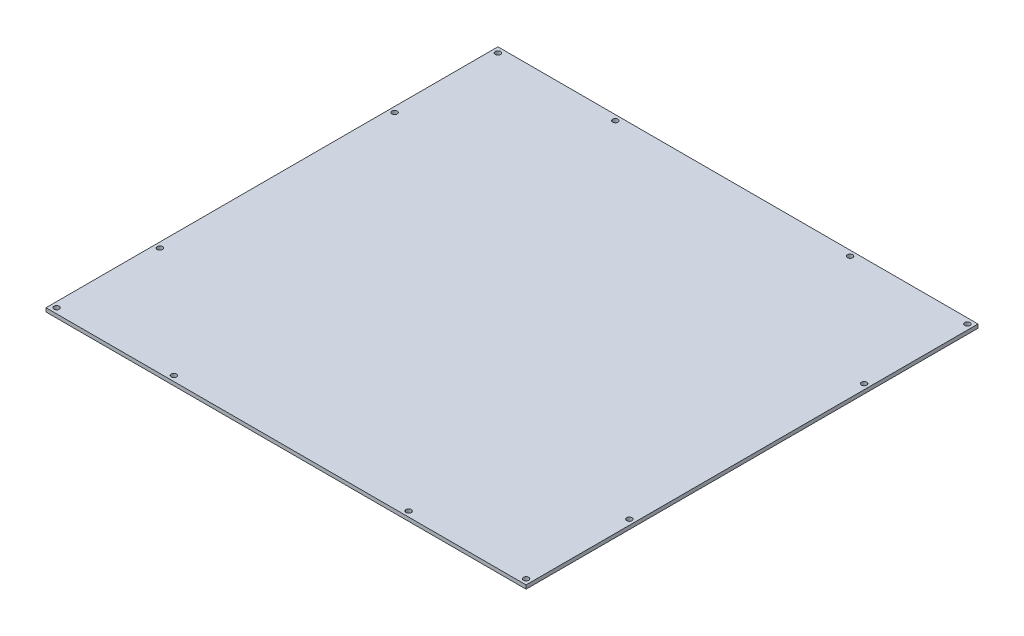
ISO-10303-21;
HEADER;
FILE_DESCRIPTION(('STEP AP214'),'2;1');
FILE_NAME('part.step','',(''),(''),'','','');
FILE_SCHEMA(('AUTOMOTIVE_DESIGN { 1 0 10303 214 1 1 1 1 }'));
ENDSEC;
DATA;
#1=APPLICATION_CONTEXT('core data for automotive mechanical design processes');
#2=APPLICATION_PROTOCOL_DEFINITION('international standard','automotive_design',2000,#1);
#3=PRODUCT_CONTEXT('',#1,'mechanical');
#4=PRODUCT('Part','Part','',(#3));
#5=PRODUCT_RELATED_PRODUCT_CATEGORY('part','',(#4));
#6=PRODUCT_DEFINITION_FORMATION('','',#4);
#7=PRODUCT_DEFINITION_CONTEXT('part definition',#1,'design');
#8=PRODUCT_DEFINITION('design','',#6,#7);
#9=PRODUCT_DEFINITION_SHAPE('','',#8);
#10=(LENGTH_UNIT() NAMED_UNIT(*) SI_UNIT(.MILLI.,.METRE.));
#11=(NAMED_UNIT(*) PLANE_ANGLE_UNIT() SI_UNIT($,.RADIAN.));
#12=(NAMED_UNIT(*) SI_UNIT($,.STERADIAN.) SOLID_ANGLE_UNIT());
#13=UNCERTAINTY_MEASURE_WITH_UNIT(LENGTH_MEASURE(1.E-05),#10,'distance_accuracy_value','');
#14=(GEOMETRIC_REPRESENTATION_CONTEXT(3) GLOBAL_UNCERTAINTY_ASSIGNED_CONTEXT((#13)) GLOBAL_UNIT_ASSIGNED_CONTEXT((#10,
#11,#12)) REPRESENTATION_CONTEXT('',''));
#15=CARTESIAN_POINT('',(0.,0.,0.));
#16=DIRECTION('',(0.,0.,1.));
#17=DIRECTION('',(1.,0.,0.));
#18=AXIS2_PLACEMENT_3D('',#15,#16,#17);
#19=CARTESIAN_POINT('',(0.,0.,0.));
#20=DIRECTION('',(0.,-1.,0.));
#21=DIRECTION('',(0.,0.,-1.));
#22=AXIS2_PLACEMENT_3D('',#19,#20,#21);
#23=PLANE('',#22);
#24=CARTESIAN_POINT('',(-200.,0.,-188.));
#25=DIRECTION('',(0.,1.,0.));
#26=DIRECTION('',(0.,0.,1.));
#27=AXIS2_PLACEMENT_3D('',#24,#25,#26);
#28=CIRCLE('',#27,2.25);
#29=CARTESIAN_POINT('',(-200.,0.,-185.75));
#30=VERTEX_POINT('',#29);
#31=EDGE_CURVE('E216',#30,#30,#28,.T.);
#32=ORIENTED_EDGE('',*,*,#31,.T.);
#33=EDGE_LOOP('',(#32));
#34=FACE_BOUND('',#33,.T.);
#35=CARTESIAN_POINT('',(-200.,0.,-100.));
#36=DIRECTION('',(0.,1.,0.));
#37=DIRECTION('',(0.,0.,1.));
#38=AXIS2_PLACEMENT_3D('',#35,#36,#37);
#39=CIRCLE('',#38,2.25);
#40=CARTESIAN_POINT('',(-200.,0.,-97.75));
#41=VERTEX_POINT('',#40);
#42=EDGE_CURVE('E208',#41,#41,#39,.T.);
#43=ORIENTED_EDGE('',*,*,#42,.T.);
#44=EDGE_LOOP('',(#43));
#45=FACE_BOUND('',#44,.T.);
#46=CARTESIAN_POINT('',(-200.,0.,100.));
#47=DIRECTION('',(0.,1.,0.));
#48=DIRECTION('',(0.,0.,1.));
#49=AXIS2_PLACEMENT_3D('',#46,#47,#48);
#50=CIRCLE('',#49,2.25);
#51=CARTESIAN_POINT('',(-200.,0.,102.25));
#52=VERTEX_POINT('',#51);
#53=EDGE_CURVE('E200',#52,#52,#50,.T.);
#54=ORIENTED_EDGE('',*,*,#53,.T.);
#55=EDGE_LOOP('',(#54));
#56=FACE_BOUND('',#55,.T.);
#57=CARTESIAN_POINT('',(200.,0.,100.));
#58=DIRECTION('',(0.,1.,0.));
#59=DIRECTION('',(0.,0.,1.));
#60=AXIS2_PLACEMENT_3D('',#57,#58,#59);
#61=CIRCLE('',#60,2.25);
#62=CARTESIAN_POINT('',(200.,0.,102.25));
#63=VERTEX_POINT('',#62);
#64=EDGE_CURVE('E192',#63,#63,#61,.T.);
#65=ORIENTED_EDGE('',*,*,#64,.T.);
#66=EDGE_LOOP('',(#65));
#67=FACE_BOUND('',#66,.T.);
#68=CARTESIAN_POINT('',(200.,0.,-100.));
#69=DIRECTION('',(0.,1.,0.));
#70=DIRECTION('',(0.,0.,1.));
#71=AXIS2_PLACEMENT_3D('',#68,#69,#70);
#72=CIRCLE('',#71,2.25);
#73=CARTESIAN_POINT('',(200.,0.,-97.75));
#74=VERTEX_POINT('',#73);
#75=EDGE_CURVE('E184',#74,#74,#72,.T.);
#76=ORIENTED_EDGE('',*,*,#75,.T.);
#77=EDGE_LOOP('',(#76));
#78=FACE_BOUND('',#77,.T.);
#79=CARTESIAN_POINT('',(200.,0.,-188.));
#80=DIRECTION('',(0.,1.,0.));
#81=DIRECTION('',(0.,0.,1.));
#82=AXIS2_PLACEMENT_3D('',#79,#80,#81);
#83=CIRCLE('',#82,2.25);
#84=CARTESIAN_POINT('',(200.,0.,-185.75));
#85=VERTEX_POINT('',#84);
#86=EDGE_CURVE('E176',#85,#85,#83,.T.);
#87=ORIENTED_EDGE('',*,*,#86,.T.);
#88=EDGE_LOOP('',(#87));
#89=FACE_BOUND('',#88,.T.);
#90=CARTESIAN_POINT('',(-100.,0.,-188.));
#91=DIRECTION('',(0.,1.,0.));
#92=DIRECTION('',(0.,0.,1.));
#93=AXIS2_PLACEMENT_3D('',#90,#91,#92);
#94=CIRCLE('',#93,2.25);
#95=CARTESIAN_POINT('',(-100.,0.,-185.75));
#96=VERTEX_POINT('',#95);
#97=EDGE_CURVE('E168',#96,#96,#94,.T.);
#98=ORIENTED_EDGE('',*,*,#97,.T.);
#99=EDGE_LOOP('',(#98));
#100=FACE_BOUND('',#99,.T.);
#101=CARTESIAN_POINT('',(100.,0.,-188.));
#102=DIRECTION('',(0.,1.,0.));
#103=DIRECTION('',(0.,0.,1.));
#104=AXIS2_PLACEMENT_3D('',#101,#102,#103);
#105=CIRCLE('',#104,2.25);
#106=CARTESIAN_POINT('',(100.,0.,-185.75));
#107=VERTEX_POINT('',#106);
#108=EDGE_CURVE('E160',#107,#107,#105,.T.);
#109=ORIENTED_EDGE('',*,*,#108,.T.);
#110=EDGE_LOOP('',(#109));
#111=FACE_BOUND('',#110,.T.);
#112=CARTESIAN_POINT('',(100.,0.,188.));
#113=DIRECTION('',(0.,1.,0.));
#114=DIRECTION('',(0.,0.,1.));
#115=AXIS2_PLACEMENT_3D('',#112,#113,#114);
#116=CIRCLE('',#115,2.25);
#117=CARTESIAN_POINT('',(100.,0.,190.25));
#118=VERTEX_POINT('',#117);
#119=EDGE_CURVE('E152',#118,#118,#116,.T.);
#120=ORIENTED_EDGE('',*,*,#119,.T.);
#121=EDGE_LOOP('',(#120));
#122=FACE_BOUND('',#121,.T.);
#123=DIRECTION('',(0.,0.,-1.));
#124=VECTOR('',#123,1.);
#125=CARTESIAN_POINT('',(204.5,0.,192.5));
#126=LINE('',#125,#124);
#127=CARTESIAN_POINT('',(204.5,0.,192.5));
#128=VERTEX_POINT('',#127);
#129=CARTESIAN_POINT('',(204.5,0.,-192.5));
#130=VERTEX_POINT('',#129);
#131=EDGE_CURVE('E108',#128,#130,#126,.T.);
#132=ORIENTED_EDGE('',*,*,#131,.F.);
#133=DIRECTION('',(1.,0.,0.));
#134=VECTOR('',#133,1.);
#135=CARTESIAN_POINT('',(-204.5,0.,192.5));
#136=LINE('',#135,#134);
#137=CARTESIAN_POINT('',(-204.5,0.,192.5));
#138=VERTEX_POINT('',#137);
#139=EDGE_CURVE('E80',#138,#128,#136,.T.);
#140=ORIENTED_EDGE('',*,*,#139,.F.);
#141=DIRECTION('',(0.,0.,1.));
#142=VECTOR('',#141,1.);
#143=CARTESIAN_POINT('',(-204.5,0.,192.5));
#144=LINE('',#143,#142);
#145=CARTESIAN_POINT('',(-204.5,0.,-192.5));
#146=VERTEX_POINT('',#145);
#147=EDGE_CURVE('E74',#146,#138,#144,.T.);
#148=ORIENTED_EDGE('',*,*,#147,.F.);
#149=DIRECTION('',(-1.,0.,0.));
#150=VECTOR('',#149,1.);
#151=CARTESIAN_POINT('',(-204.5,0.,-192.5));
#152=LINE('',#151,#150);
#153=EDGE_CURVE('E97',#130,#146,#152,.T.);
#154=ORIENTED_EDGE('',*,*,#153,.F.);
#155=EDGE_LOOP('',(#132,#140,#148,#154));
#156=FACE_BOUND('',#155,.T.);
#157=CARTESIAN_POINT('',(-200.,0.,188.));
#158=DIRECTION('',(0.,1.,0.));
#159=DIRECTION('',(0.,0.,1.));
#160=AXIS2_PLACEMENT_3D('',#157,#158,#159);
#161=CIRCLE('',#160,2.25);
#162=CARTESIAN_POINT('',(-200.,0.,190.25));
#163=VERTEX_POINT('',#162);
#164=EDGE_CURVE('E112',#163,#163,#161,.T.);
#165=ORIENTED_EDGE('',*,*,#164,.T.);
#166=EDGE_LOOP('',(#165));
#167=FACE_BOUND('',#166,.T.);
#168=CARTESIAN_POINT('',(200.,0.,188.));
#169=DIRECTION('',(0.,1.,0.));
#170=DIRECTION('',(0.,0.,1.));
#171=AXIS2_PLACEMENT_3D('',#168,#169,#170);
#172=CIRCLE('',#171,2.25);
#173=CARTESIAN_POINT('',(200.,0.,190.25));
#174=VERTEX_POINT('',#173);
#175=EDGE_CURVE('E136',#174,#174,#172,.T.);
#176=ORIENTED_EDGE('',*,*,#175,.T.);
#177=EDGE_LOOP('',(#176));
#178=FACE_BOUND('',#177,.T.);
#179=CARTESIAN_POINT('',(-100.,0.,188.));
#180=DIRECTION('',(0.,1.,0.));
#181=DIRECTION('',(0.,0.,1.));
#182=AXIS2_PLACEMENT_3D('',#179,#180,#181);
#183=CIRCLE('',#182,2.25);
#184=CARTESIAN_POINT('',(-100.,0.,190.25));
#185=VERTEX_POINT('',#184);
#186=EDGE_CURVE('E144',#185,#185,#183,.T.);
#187=ORIENTED_EDGE('',*,*,#186,.T.);
#188=EDGE_LOOP('',(#187));
#189=FACE_BOUND('',#188,.T.);
#190=ADVANCED_FACE('F39',(#34,#45,#56,#67,#78,#89,#100,#111,#122,#156,#167,#178,#189),#23,.T.);
#191=CARTESIAN_POINT('',(204.5,3.175,192.5));
#192=DIRECTION('',(-1.,0.,0.));
#193=DIRECTION('',(0.,0.,1.));
#194=AXIS2_PLACEMENT_3D('',#191,#192,#193);
#195=PLANE('',#194);
#196=ORIENTED_EDGE('',*,*,#131,.T.);
#197=DIRECTION('',(0.,-1.,0.));
#198=VECTOR('',#197,1.);
#199=CARTESIAN_POINT('',(204.5,3.175,-192.5));
#200=LINE('',#199,#198);
#201=CARTESIAN_POINT('',(204.5,3.175,-192.5));
#202=VERTEX_POINT('',#201);
#203=EDGE_CURVE('E11',#202,#130,#200,.T.);
#204=ORIENTED_EDGE('',*,*,#203,.F.);
#205=DIRECTION('',(0.,0.,-1.));
#206=VECTOR('',#205,1.);
#207=CARTESIAN_POINT('',(204.5,3.175,192.5));
#208=LINE('',#207,#206);
#209=CARTESIAN_POINT('',(204.5,3.175,192.5));
#210=VERTEX_POINT('',#209);
#211=EDGE_CURVE('E92',#210,#202,#208,.T.);
#212=ORIENTED_EDGE('',*,*,#211,.F.);
#213=DIRECTION('',(0.,-1.,0.));
#214=VECTOR('',#213,1.);
#215=CARTESIAN_POINT('',(204.5,3.175,192.5));
#216=LINE('',#215,#214);
#217=EDGE_CURVE('E104',#210,#128,#216,.T.);
#218=ORIENTED_EDGE('',*,*,#217,.T.);
#219=EDGE_LOOP('',(#196,#204,#212,#218));
#220=FACE_BOUND('',#219,.T.);
#221=ADVANCED_FACE('F41',(#220),#195,.F.);
#222=CARTESIAN_POINT('',(-204.5,3.175,-192.5));
#223=DIRECTION('',(0.,0.,1.));
#224=DIRECTION('',(1.,0.,0.));
#225=AXIS2_PLACEMENT_3D('',#222,#223,#224);
#226=PLANE('',#225);
#227=ORIENTED_EDGE('',*,*,#153,.T.);
#228=DIRECTION('',(0.,-1.,0.));
#229=VECTOR('',#228,1.);
#230=CARTESIAN_POINT('',(-204.5,3.175,-192.5));
#231=LINE('',#230,#229);
#232=CARTESIAN_POINT('',(-204.5,3.175,-192.5));
#233=VERTEX_POINT('',#232);
#234=EDGE_CURVE('E49',#233,#146,#231,.T.);
#235=ORIENTED_EDGE('',*,*,#234,.F.);
#236=DIRECTION('',(-1.,0.,0.));
#237=VECTOR('',#236,1.);
#238=CARTESIAN_POINT('',(-204.5,3.175,-192.5));
#239=LINE('',#238,#237);
#240=EDGE_CURVE('E87',#202,#233,#239,.T.);
#241=ORIENTED_EDGE('',*,*,#240,.F.);
#242=ORIENTED_EDGE('',*,*,#203,.T.);
#243=EDGE_LOOP('',(#227,#235,#241,#242));
#244=FACE_BOUND('',#243,.T.);
#245=ADVANCED_FACE('F96',(#244),#226,.F.);
#246=CARTESIAN_POINT('',(-204.5,3.175,192.5));
#247=DIRECTION('',(1.,0.,0.));
#248=DIRECTION('',(0.,0.,-1.));
#249=AXIS2_PLACEMENT_3D('',#246,#247,#248);
#250=PLANE('',#249);
#251=ORIENTED_EDGE('',*,*,#147,.T.);
#252=DIRECTION('',(0.,-1.,0.));
#253=VECTOR('',#252,1.);
#254=CARTESIAN_POINT('',(-204.5,3.175,192.5));
#255=LINE('',#254,#253);
#256=CARTESIAN_POINT('',(-204.5,3.175,192.5));
#257=VERTEX_POINT('',#256);
#258=EDGE_CURVE('E99',#257,#138,#255,.T.);
#259=ORIENTED_EDGE('',*,*,#258,.F.);
#260=DIRECTION('',(0.,0.,1.));
#261=VECTOR('',#260,1.);
#262=CARTESIAN_POINT('',(-204.5,3.175,192.5));
#263=LINE('',#262,#261);
#264=EDGE_CURVE('E90',#233,#257,#263,.T.);
#265=ORIENTED_EDGE('',*,*,#264,.F.);
#266=ORIENTED_EDGE('',*,*,#234,.T.);
#267=EDGE_LOOP('',(#251,#259,#265,#266));
#268=FACE_BOUND('',#267,.T.);
#269=ADVANCED_FACE('F100',(#268),#250,.F.);
#270=CARTESIAN_POINT('',(-204.5,3.175,192.5));
#271=DIRECTION('',(0.,0.,-1.));
#272=DIRECTION('',(-1.,0.,0.));
#273=AXIS2_PLACEMENT_3D('',#270,#271,#272);
#274=PLANE('',#273);
#275=ORIENTED_EDGE('',*,*,#139,.T.);
#276=ORIENTED_EDGE('',*,*,#217,.F.);
#277=DIRECTION('',(1.,0.,0.));
#278=VECTOR('',#277,1.);
#279=CARTESIAN_POINT('',(-204.5,3.175,192.5));
#280=LINE('',#279,#278);
#281=EDGE_CURVE('E57',#257,#210,#280,.T.);
#282=ORIENTED_EDGE('',*,*,#281,.F.);
#283=ORIENTED_EDGE('',*,*,#258,.T.);
#284=EDGE_LOOP('',(#275,#276,#282,#283));
#285=FACE_BOUND('',#284,.T.);
#286=ADVANCED_FACE('F122',(#285),#274,.F.);
#287=CARTESIAN_POINT('',(0.,3.175,0.));
#288=DIRECTION('',(0.,-1.,0.));
#289=DIRECTION('',(0.,0.,-1.));
#290=AXIS2_PLACEMENT_3D('',#287,#288,#289);
#291=PLANE('',#290);
#292=CARTESIAN_POINT('',(-200.,3.175,-188.));
#293=DIRECTION('',(0.,1.,0.));
#294=DIRECTION('',(0.,0.,1.));
#295=AXIS2_PLACEMENT_3D('',#292,#293,#294);
#296=CIRCLE('',#295,2.25);
#297=CARTESIAN_POINT('',(-200.,3.175,-185.75));
#298=VERTEX_POINT('',#297);
#299=EDGE_CURVE('E220',#298,#298,#296,.T.);
#300=ORIENTED_EDGE('',*,*,#299,.F.);
#301=EDGE_LOOP('',(#300));
#302=FACE_BOUND('',#301,.T.);
#303=CARTESIAN_POINT('',(-200.,3.175,-100.));
#304=DIRECTION('',(0.,1.,0.));
#305=DIRECTION('',(0.,0.,1.));
#306=AXIS2_PLACEMENT_3D('',#303,#304,#305);
#307=CIRCLE('',#306,2.25);
#308=CARTESIAN_POINT('',(-200.,3.175,-97.75));
#309=VERTEX_POINT('',#308);
#310=EDGE_CURVE('E212',#309,#309,#307,.T.);
#311=ORIENTED_EDGE('',*,*,#310,.F.);
#312=EDGE_LOOP('',(#311));
#313=FACE_BOUND('',#312,.T.);
#314=CARTESIAN_POINT('',(-200.,3.175,100.));
#315=DIRECTION('',(0.,1.,0.));
#316=DIRECTION('',(0.,0.,1.));
#317=AXIS2_PLACEMENT_3D('',#314,#315,#316);
#318=CIRCLE('',#317,2.25);
#319=CARTESIAN_POINT('',(-200.,3.175,102.25));
#320=VERTEX_POINT('',#319);
#321=EDGE_CURVE('E204',#320,#320,#318,.T.);
#322=ORIENTED_EDGE('',*,*,#321,.F.);
#323=EDGE_LOOP('',(#322));
#324=FACE_BOUND('',#323,.T.);
#325=CARTESIAN_POINT('',(200.,3.175,100.));
#326=DIRECTION('',(0.,1.,0.));
#327=DIRECTION('',(0.,0.,1.));
#328=AXIS2_PLACEMENT_3D('',#325,#326,#327);
#329=CIRCLE('',#328,2.25);
#330=CARTESIAN_POINT('',(200.,3.175,102.25));
#331=VERTEX_POINT('',#330);
#332=EDGE_CURVE('E196',#331,#331,#329,.T.);
#333=ORIENTED_EDGE('',*,*,#332,.F.);
#334=EDGE_LOOP('',(#333));
#335=FACE_BOUND('',#334,.T.);
#336=CARTESIAN_POINT('',(200.,3.175,-100.));
#337=DIRECTION('',(0.,1.,0.));
#338=DIRECTION('',(0.,0.,1.));
#339=AXIS2_PLACEMENT_3D('',#336,#337,#338);
#340=CIRCLE('',#339,2.25);
#341=CARTESIAN_POINT('',(200.,3.175,-97.75));
#342=VERTEX_POINT('',#341);
#343=EDGE_CURVE('E188',#342,#342,#340,.T.);
#344=ORIENTED_EDGE('',*,*,#343,.F.);
#345=EDGE_LOOP('',(#344));
#346=FACE_BOUND('',#345,.T.);
#347=CARTESIAN_POINT('',(200.,3.175,-188.));
#348=DIRECTION('',(0.,1.,0.));
#349=DIRECTION('',(0.,0.,1.));
#350=AXIS2_PLACEMENT_3D('',#347,#348,#349);
#351=CIRCLE('',#350,2.25);
#352=CARTESIAN_POINT('',(200.,3.175,-185.75));
#353=VERTEX_POINT('',#352);
#354=EDGE_CURVE('E180',#353,#353,#351,.T.);
#355=ORIENTED_EDGE('',*,*,#354,.F.);
#356=EDGE_LOOP('',(#355));
#357=FACE_BOUND('',#356,.T.);
#358=CARTESIAN_POINT('',(-100.,3.175,-188.));
#359=DIRECTION('',(0.,1.,0.));
#360=DIRECTION('',(0.,0.,1.));
#361=AXIS2_PLACEMENT_3D('',#358,#359,#360);
#362=CIRCLE('',#361,2.25);
#363=CARTESIAN_POINT('',(-100.,3.175,-185.75));
#364=VERTEX_POINT('',#363);
#365=EDGE_CURVE('E172',#364,#364,#362,.T.);
#366=ORIENTED_EDGE('',*,*,#365,.F.);
#367=EDGE_LOOP('',(#366));
#368=FACE_BOUND('',#367,.T.);
#369=CARTESIAN_POINT('',(100.,3.175,-188.));
#370=DIRECTION('',(0.,1.,0.));
#371=DIRECTION('',(0.,0.,1.));
#372=AXIS2_PLACEMENT_3D('',#369,#370,#371);
#373=CIRCLE('',#372,2.25);
#374=CARTESIAN_POINT('',(100.,3.175,-185.75));
#375=VERTEX_POINT('',#374);
#376=EDGE_CURVE('E164',#375,#375,#373,.T.);
#377=ORIENTED_EDGE('',*,*,#376,.F.);
#378=EDGE_LOOP('',(#377));
#379=FACE_BOUND('',#378,.T.);
#380=CARTESIAN_POINT('',(100.,3.175,188.));
#381=DIRECTION('',(0.,1.,0.));
#382=DIRECTION('',(0.,0.,1.));
#383=AXIS2_PLACEMENT_3D('',#380,#381,#382);
#384=CIRCLE('',#383,2.25);
#385=CARTESIAN_POINT('',(100.,3.175,190.25));
#386=VERTEX_POINT('',#385);
#387=EDGE_CURVE('E156',#386,#386,#384,.T.);
#388=ORIENTED_EDGE('',*,*,#387,.F.);
#389=EDGE_LOOP('',(#388));
#390=FACE_BOUND('',#389,.T.);
#391=CARTESIAN_POINT('',(-100.,3.175,188.));
#392=DIRECTION('',(0.,1.,0.));
#393=DIRECTION('',(0.,0.,1.));
#394=AXIS2_PLACEMENT_3D('',#391,#392,#393);
#395=CIRCLE('',#394,2.25);
#396=CARTESIAN_POINT('',(-100.,3.175,190.25));
#397=VERTEX_POINT('',#396);
#398=EDGE_CURVE('E148',#397,#397,#395,.T.);
#399=ORIENTED_EDGE('',*,*,#398,.F.);
#400=EDGE_LOOP('',(#399));
#401=FACE_BOUND('',#400,.T.);
#402=CARTESIAN_POINT('',(200.,3.175,188.));
#403=DIRECTION('',(0.,1.,0.));
#404=DIRECTION('',(0.,0.,1.));
#405=AXIS2_PLACEMENT_3D('',#402,#403,#404);
#406=CIRCLE('',#405,2.25);
#407=CARTESIAN_POINT('',(200.,3.175,190.25));
#408=VERTEX_POINT('',#407);
#409=EDGE_CURVE('E140',#408,#408,#406,.T.);
#410=ORIENTED_EDGE('',*,*,#409,.F.);
#411=EDGE_LOOP('',(#410));
#412=FACE_BOUND('',#411,.T.);
#413=CARTESIAN_POINT('',(-200.,3.175,188.));
#414=DIRECTION('',(0.,1.,0.));
#415=DIRECTION('',(0.,0.,1.));
#416=AXIS2_PLACEMENT_3D('',#413,#414,#415);
#417=CIRCLE('',#416,2.25);
#418=CARTESIAN_POINT('',(-200.,3.175,190.25));
#419=VERTEX_POINT('',#418);
#420=EDGE_CURVE('E132',#419,#419,#417,.T.);
#421=ORIENTED_EDGE('',*,*,#420,.F.);
#422=EDGE_LOOP('',(#421));
#423=FACE_BOUND('',#422,.T.);
#424=ORIENTED_EDGE('',*,*,#211,.T.);
#425=ORIENTED_EDGE('',*,*,#240,.T.);
#426=ORIENTED_EDGE('',*,*,#264,.T.);
#427=ORIENTED_EDGE('',*,*,#281,.T.);
#428=EDGE_LOOP('',(#424,#425,#426,#427));
#429=FACE_BOUND('',#428,.T.);
#430=ADVANCED_FACE('F88',(#302,#313,#324,#335,#346,#357,#368,#379,#390,#401,#412,#423,#429),
#291,.F.);
#431=CARTESIAN_POINT('',(-200.,3.175,188.));
#432=DIRECTION('',(0.,1.,0.));
#433=DIRECTION('',(0.,0.,1.));
#434=AXIS2_PLACEMENT_3D('',#431,#432,#433);
#435=CYLINDRICAL_SURFACE('',#434,2.25);
#436=ORIENTED_EDGE('',*,*,#164,.F.);
#437=EDGE_LOOP('',(#436));
#438=FACE_BOUND('',#437,.T.);
#439=ORIENTED_EDGE('',*,*,#420,.T.);
#440=EDGE_LOOP('',(#439));
#441=FACE_BOUND('',#440,.T.);
#442=ADVANCED_FACE('F229',(#438,#441),#435,.F.);
#443=CARTESIAN_POINT('',(200.,3.175,188.));
#444=DIRECTION('',(0.,1.,0.));
#445=DIRECTION('',(0.,0.,1.));
#446=AXIS2_PLACEMENT_3D('',#443,#444,#445);
#447=CYLINDRICAL_SURFACE('',#446,2.25);
#448=ORIENTED_EDGE('',*,*,#175,.F.);
#449=EDGE_LOOP('',(#448));
#450=FACE_BOUND('',#449,.T.);
#451=ORIENTED_EDGE('',*,*,#409,.T.);
#452=EDGE_LOOP('',(#451));
#453=FACE_BOUND('',#452,.T.);
#454=ADVANCED_FACE('F254',(#450,#453),#447,.F.);
#455=CARTESIAN_POINT('',(-100.,3.175,188.));
#456=DIRECTION('',(0.,1.,0.));
#457=DIRECTION('',(0.,0.,1.));
#458=AXIS2_PLACEMENT_3D('',#455,#456,#457);
#459=CYLINDRICAL_SURFACE('',#458,2.25);
#460=ORIENTED_EDGE('',*,*,#186,.F.);
#461=EDGE_LOOP('',(#460));
#462=FACE_BOUND('',#461,.T.);
#463=ORIENTED_EDGE('',*,*,#398,.T.);
#464=EDGE_LOOP('',(#463));
#465=FACE_BOUND('',#464,.T.);
#466=ADVANCED_FACE('F260',(#462,#465),#459,.F.);
#467=CARTESIAN_POINT('',(100.,3.175,188.));
#468=DIRECTION('',(0.,1.,0.));
#469=DIRECTION('',(0.,0.,1.));
#470=AXIS2_PLACEMENT_3D('',#467,#468,#469);
#471=CYLINDRICAL_SURFACE('',#470,2.25);
#472=ORIENTED_EDGE('',*,*,#119,.F.);
#473=EDGE_LOOP('',(#472));
#474=FACE_BOUND('',#473,.T.);
#475=ORIENTED_EDGE('',*,*,#387,.T.);
#476=EDGE_LOOP('',(#475));
#477=FACE_BOUND('',#476,.T.);
#478=ADVANCED_FACE('F313',(#474,#477),#471,.F.);
#479=CARTESIAN_POINT('',(100.,3.175,-188.));
#480=DIRECTION('',(0.,1.,0.));
#481=DIRECTION('',(0.,0.,1.));
#482=AXIS2_PLACEMENT_3D('',#479,#480,#481);
#483=CYLINDRICAL_SURFACE('',#482,2.25);
#484=ORIENTED_EDGE('',*,*,#108,.F.);
#485=EDGE_LOOP('',(#484));
#486=FACE_BOUND('',#485,.T.);
#487=ORIENTED_EDGE('',*,*,#376,.T.);
#488=EDGE_LOOP('',(#487));
#489=FACE_BOUND('',#488,.T.);
#490=ADVANCED_FACE('F323',(#486,#489),#483,.F.);
#491=CARTESIAN_POINT('',(-100.,3.175,-188.));
#492=DIRECTION('',(0.,1.,0.));
#493=DIRECTION('',(0.,0.,1.));
#494=AXIS2_PLACEMENT_3D('',#491,#492,#493);
#495=CYLINDRICAL_SURFACE('',#494,2.25);
#496=ORIENTED_EDGE('',*,*,#97,.F.);
#497=EDGE_LOOP('',(#496));
#498=FACE_BOUND('',#497,.T.);
#499=ORIENTED_EDGE('',*,*,#365,.T.);
#500=EDGE_LOOP('',(#499));
#501=FACE_BOUND('',#500,.T.);
#502=ADVANCED_FACE('F333',(#498,#501),#495,.F.);
#503=CARTESIAN_POINT('',(200.,3.175,-188.));
#504=DIRECTION('',(0.,1.,0.));
#505=DIRECTION('',(0.,0.,1.));
#506=AXIS2_PLACEMENT_3D('',#503,#504,#505);
#507=CYLINDRICAL_SURFACE('',#506,2.25);
#508=ORIENTED_EDGE('',*,*,#86,.F.);
#509=EDGE_LOOP('',(#508));
#510=FACE_BOUND('',#509,.T.);
#511=ORIENTED_EDGE('',*,*,#354,.T.);
#512=EDGE_LOOP('',(#511));
#513=FACE_BOUND('',#512,.T.);
#514=ADVANCED_FACE('F343',(#510,#513),#507,.F.);
#515=CARTESIAN_POINT('',(200.,3.175,-100.));
#516=DIRECTION('',(0.,1.,0.));
#517=DIRECTION('',(0.,0.,1.));
#518=AXIS2_PLACEMENT_3D('',#515,#516,#517);
#519=CYLINDRICAL_SURFACE('',#518,2.25);
#520=ORIENTED_EDGE('',*,*,#75,.F.);
#521=EDGE_LOOP('',(#520));
#522=FACE_BOUND('',#521,.T.);
#523=ORIENTED_EDGE('',*,*,#343,.T.);
#524=EDGE_LOOP('',(#523));
#525=FACE_BOUND('',#524,.T.);
#526=ADVANCED_FACE('F353',(#522,#525),#519,.F.);
#527=CARTESIAN_POINT('',(200.,3.175,100.));
#528=DIRECTION('',(0.,1.,0.));
#529=DIRECTION('',(0.,0.,1.));
#530=AXIS2_PLACEMENT_3D('',#527,#528,#529);
#531=CYLINDRICAL_SURFACE('',#530,2.25);
#532=ORIENTED_EDGE('',*,*,#64,.F.);
#533=EDGE_LOOP('',(#532));
#534=FACE_BOUND('',#533,.T.);
#535=ORIENTED_EDGE('',*,*,#332,.T.);
#536=EDGE_LOOP('',(#535));
#537=FACE_BOUND('',#536,.T.);
#538=ADVANCED_FACE('F363',(#534,#537),#531,.F.);
#539=CARTESIAN_POINT('',(-200.,3.175,100.));
#540=DIRECTION('',(0.,1.,0.));
#541=DIRECTION('',(0.,0.,1.));
#542=AXIS2_PLACEMENT_3D('',#539,#540,#541);
#543=CYLINDRICAL_SURFACE('',#542,2.25);
#544=ORIENTED_EDGE('',*,*,#53,.F.);
#545=EDGE_LOOP('',(#544));
#546=FACE_BOUND('',#545,.T.);
#547=ORIENTED_EDGE('',*,*,#321,.T.);
#548=EDGE_LOOP('',(#547));
#549=FACE_BOUND('',#548,.T.);
#550=ADVANCED_FACE('F373',(#546,#549),#543,.F.);
#551=CARTESIAN_POINT('',(-200.,3.175,-100.));
#552=DIRECTION('',(0.,1.,0.));
#553=DIRECTION('',(0.,0.,1.));
#554=AXIS2_PLACEMENT_3D('',#551,#552,#553);
#555=CYLINDRICAL_SURFACE('',#554,2.25);
#556=ORIENTED_EDGE('',*,*,#42,.F.);
#557=EDGE_LOOP('',(#556));
#558=FACE_BOUND('',#557,.T.);
#559=ORIENTED_EDGE('',*,*,#310,.T.);
#560=EDGE_LOOP('',(#559));
#561=FACE_BOUND('',#560,.T.);
#562=ADVANCED_FACE('F383',(#558,#561),#555,.F.);
#563=CARTESIAN_POINT('',(-200.,3.175,-188.));
#564=DIRECTION('',(0.,1.,0.));
#565=DIRECTION('',(0.,0.,1.));
#566=AXIS2_PLACEMENT_3D('',#563,#564,#565);
#567=CYLINDRICAL_SURFACE('',#566,2.25);
#568=ORIENTED_EDGE('',*,*,#31,.F.);
#569=EDGE_LOOP('',(#568));
#570=FACE_BOUND('',#569,.T.);
#571=ORIENTED_EDGE('',*,*,#299,.T.);
#572=EDGE_LOOP('',(#571));
#573=FACE_BOUND('',#572,.T.);
#574=ADVANCED_FACE('F225',(#570,#573),#567,.F.);
#575=CLOSED_SHELL('',(#190,#221,#245,#269,#286,#430,#442,#454,#466,#478,#490,#502,#514,#526,
#538,#550,#562,#574));
#576=MANIFOLD_SOLID_BREP('B2',#575);
#577=ADVANCED_BREP_SHAPE_REPRESENTATION('',(#18,#576),#14);
#578=SHAPE_DEFINITION_REPRESENTATION(#9,#577);
ENDSEC;
END-ISO-10303-21;
